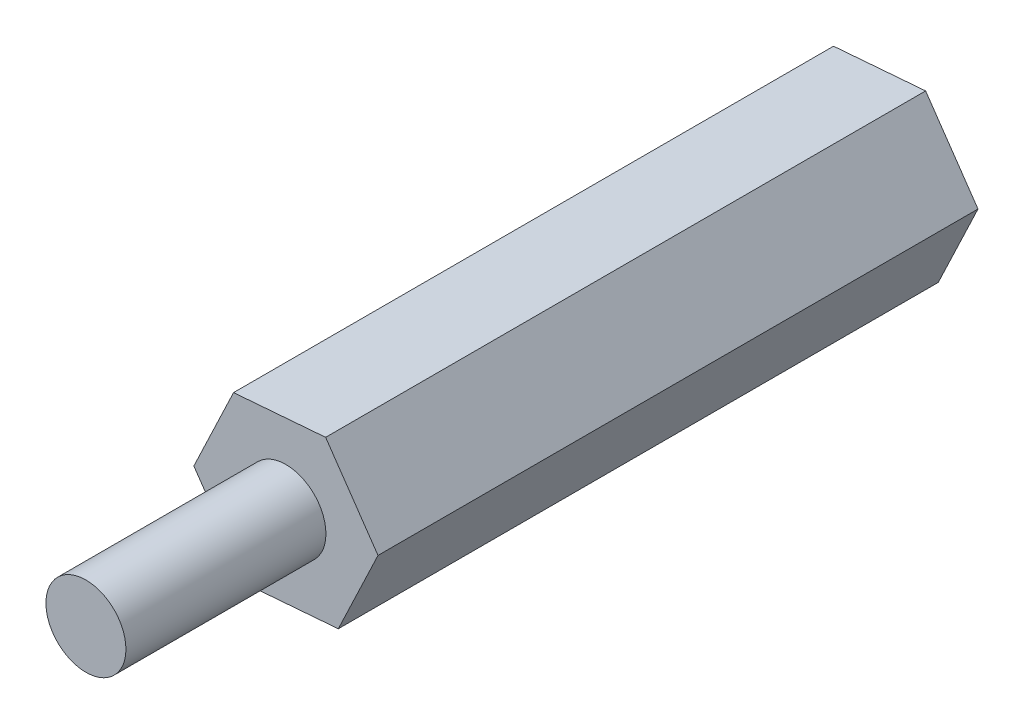
ISO-10303-21;
HEADER;
FILE_DESCRIPTION(('STEP AP214'),'2;1');
FILE_NAME('part.step','',(''),(''),'','','');
FILE_SCHEMA(('AUTOMOTIVE_DESIGN { 1 0 10303 214 1 1 1 1 }'));
ENDSEC;
DATA;
#1=APPLICATION_CONTEXT('core data for automotive mechanical design processes');
#2=APPLICATION_PROTOCOL_DEFINITION('international standard','automotive_design',2000,#1);
#3=PRODUCT_CONTEXT('',#1,'mechanical');
#4=PRODUCT('Part','Part','',(#3));
#5=PRODUCT_RELATED_PRODUCT_CATEGORY('part','',(#4));
#6=PRODUCT_DEFINITION_FORMATION('','',#4);
#7=PRODUCT_DEFINITION_CONTEXT('part definition',#1,'design');
#8=PRODUCT_DEFINITION('design','',#6,#7);
#9=PRODUCT_DEFINITION_SHAPE('','',#8);
#10=(LENGTH_UNIT() NAMED_UNIT(*) SI_UNIT(.MILLI.,.METRE.));
#11=(NAMED_UNIT(*) PLANE_ANGLE_UNIT() SI_UNIT($,.RADIAN.));
#12=(NAMED_UNIT(*) SI_UNIT($,.STERADIAN.) SOLID_ANGLE_UNIT());
#13=UNCERTAINTY_MEASURE_WITH_UNIT(LENGTH_MEASURE(1.E-05),#10,'distance_accuracy_value','');
#14=(GEOMETRIC_REPRESENTATION_CONTEXT(3) GLOBAL_UNCERTAINTY_ASSIGNED_CONTEXT((#13)) GLOBAL_UNIT_ASSIGNED_CONTEXT((#10,
#11,#12)) REPRESENTATION_CONTEXT('',''));
#15=CARTESIAN_POINT('',(0.,0.,0.));
#16=DIRECTION('',(0.,0.,1.));
#17=DIRECTION('',(1.,0.,0.));
#18=AXIS2_PLACEMENT_3D('',#15,#16,#17);
#19=CARTESIAN_POINT('',(1.30949428071029,-1.90225078843994,15.));
#20=DIRECTION('',(-0.90290973205585,0.429830217363592,0.));
#21=DIRECTION('',(-0.429830217363592,-0.90290973205585,0.));
#22=AXIS2_PLACEMENT_3D('',#19,#20,#21);
#23=PLANE('',#22);
#24=DIRECTION('',(0.429830217363592,0.90290973205585,0.));
#25=VECTOR('',#24,1.);
#26=CARTESIAN_POINT('',(1.30949428071029,-1.90225078843994,0.));
#27=LINE('',#26,#25);
#28=CARTESIAN_POINT('',(1.30949428071029,-1.90225078843994,0.));
#29=VERTEX_POINT('',#28);
#30=CARTESIAN_POINT('',(2.30214464751311,0.182929918985571,0.));
#31=VERTEX_POINT('',#30);
#32=EDGE_CURVE('E125',#29,#31,#27,.T.);
#33=ORIENTED_EDGE('',*,*,#32,.T.);
#34=DIRECTION('',(0.,0.,-1.));
#35=VECTOR('',#34,1.);
#36=CARTESIAN_POINT('',(2.30214464751311,0.182929918985571,15.));
#37=LINE('',#36,#35);
#38=CARTESIAN_POINT('',(2.30214464751311,0.182929918985571,15.));
#39=VERTEX_POINT('',#38);
#40=EDGE_CURVE('E42',#39,#31,#37,.T.);
#41=ORIENTED_EDGE('',*,*,#40,.F.);
#42=DIRECTION('',(0.429830217363592,0.90290973205585,0.));
#43=VECTOR('',#42,1.);
#44=CARTESIAN_POINT('',(1.30949428071029,-1.90225078843994,15.));
#45=LINE('',#44,#43);
#46=CARTESIAN_POINT('',(1.30949428071029,-1.90225078843994,15.));
#47=VERTEX_POINT('',#46);
#48=EDGE_CURVE('E136',#47,#39,#45,.T.);
#49=ORIENTED_EDGE('',*,*,#48,.F.);
#50=DIRECTION('',(0.,0.,-1.));
#51=VECTOR('',#50,1.);
#52=CARTESIAN_POINT('',(1.30949428071029,-1.90225078843994,15.));
#53=LINE('',#52,#51);
#54=EDGE_CURVE('E121',#47,#29,#53,.T.);
#55=ORIENTED_EDGE('',*,*,#54,.T.);
#56=EDGE_LOOP('',(#33,#41,#49,#55));
#57=FACE_BOUND('',#56,.T.);
#58=ADVANCED_FACE('F39',(#57),#23,.F.);
#59=CARTESIAN_POINT('',(2.30214464751311,0.182929918985571,15.));
#60=DIRECTION('',(-0.823698753578983,-0.56702765660277,0.));
#61=DIRECTION('',(0.56702765660277,-0.823698753578983,0.));
#62=AXIS2_PLACEMENT_3D('',#59,#60,#61);
#63=PLANE('',#62);
#64=DIRECTION('',(-0.56702765660277,0.823698753578983,0.));
#65=VECTOR('',#64,1.);
#66=CARTESIAN_POINT('',(2.30214464751311,0.182929918985571,0.));
#67=LINE('',#66,#65);
#68=CARTESIAN_POINT('',(0.992650366802822,2.08518070742551,0.));
#69=VERTEX_POINT('',#68);
#70=EDGE_CURVE('E128',#31,#69,#67,.T.);
#71=ORIENTED_EDGE('',*,*,#70,.T.);
#72=DIRECTION('',(0.,0.,-1.));
#73=VECTOR('',#72,1.);
#74=CARTESIAN_POINT('',(0.992650366802822,2.08518070742551,15.));
#75=LINE('',#74,#73);
#76=CARTESIAN_POINT('',(0.992650366802822,2.08518070742551,15.));
#77=VERTEX_POINT('',#76);
#78=EDGE_CURVE('E139',#77,#69,#75,.T.);
#79=ORIENTED_EDGE('',*,*,#78,.F.);
#80=DIRECTION('',(-0.56702765660277,0.823698753578983,0.));
#81=VECTOR('',#80,1.);
#82=CARTESIAN_POINT('',(2.30214464751311,0.182929918985571,15.));
#83=LINE('',#82,#81);
#84=EDGE_CURVE('E94',#39,#77,#83,.T.);
#85=ORIENTED_EDGE('',*,*,#84,.F.);
#86=ORIENTED_EDGE('',*,*,#40,.T.);
#87=EDGE_LOOP('',(#71,#79,#85,#86));
#88=FACE_BOUND('',#87,.T.);
#89=ADVANCED_FACE('F144',(#88),#63,.F.);
#90=CARTESIAN_POINT('',(0.992650366802822,2.08518070742551,15.));
#91=DIRECTION('',(0.0792109784768665,-0.996857873966363,0.));
#92=DIRECTION('',(0.996857873966363,0.0792109784768665,0.));
#93=AXIS2_PLACEMENT_3D('',#90,#91,#92);
#94=PLANE('',#93);
#95=DIRECTION('',(-0.996857873966363,-0.0792109784768665,0.));
#96=VECTOR('',#95,1.);
#97=CARTESIAN_POINT('',(0.992650366802822,2.08518070742551,0.));
#98=LINE('',#97,#96);
#99=CARTESIAN_POINT('',(-1.30949428071029,1.90225078843994,0.));
#100=VERTEX_POINT('',#99);
#101=EDGE_CURVE('E131',#69,#100,#98,.T.);
#102=ORIENTED_EDGE('',*,*,#101,.T.);
#103=DIRECTION('',(0.,0.,-1.));
#104=VECTOR('',#103,1.);
#105=CARTESIAN_POINT('',(-1.30949428071029,1.90225078843994,15.));
#106=LINE('',#105,#104);
#107=CARTESIAN_POINT('',(-1.30949428071029,1.90225078843994,15.));
#108=VERTEX_POINT('',#107);
#109=EDGE_CURVE('E116',#108,#100,#106,.T.);
#110=ORIENTED_EDGE('',*,*,#109,.F.);
#111=DIRECTION('',(-0.996857873966363,-0.0792109784768665,0.));
#112=VECTOR('',#111,1.);
#113=CARTESIAN_POINT('',(0.992650366802822,2.08518070742551,15.));
#114=LINE('',#113,#112);
#115=EDGE_CURVE('E107',#77,#108,#114,.T.);
#116=ORIENTED_EDGE('',*,*,#115,.F.);
#117=ORIENTED_EDGE('',*,*,#78,.T.);
#118=EDGE_LOOP('',(#102,#110,#116,#117));
#119=FACE_BOUND('',#118,.T.);
#120=ADVANCED_FACE('F150',(#119),#94,.F.);
#121=CARTESIAN_POINT('',(-1.30949428071029,1.90225078843994,15.));
#122=DIRECTION('',(0.90290973205585,-0.429830217363592,0.));
#123=DIRECTION('',(0.429830217363592,0.90290973205585,0.));
#124=AXIS2_PLACEMENT_3D('',#121,#122,#123);
#125=PLANE('',#124);
#126=DIRECTION('',(-0.429830217363592,-0.90290973205585,0.));
#127=VECTOR('',#126,1.);
#128=CARTESIAN_POINT('',(-1.30949428071029,1.90225078843994,0.));
#129=LINE('',#128,#127);
#130=CARTESIAN_POINT('',(-2.30214464751311,-0.182929918985571,0.));
#131=VERTEX_POINT('',#130);
#132=EDGE_CURVE('E115',#100,#131,#129,.T.);
#133=ORIENTED_EDGE('',*,*,#132,.T.);
#134=DIRECTION('',(0.,0.,-1.));
#135=VECTOR('',#134,1.);
#136=CARTESIAN_POINT('',(-2.30214464751311,-0.182929918985571,15.));
#137=LINE('',#136,#135);
#138=CARTESIAN_POINT('',(-2.30214464751311,-0.182929918985571,15.));
#139=VERTEX_POINT('',#138);
#140=EDGE_CURVE('E112',#139,#131,#137,.T.);
#141=ORIENTED_EDGE('',*,*,#140,.F.);
#142=DIRECTION('',(-0.429830217363592,-0.90290973205585,0.));
#143=VECTOR('',#142,1.);
#144=CARTESIAN_POINT('',(-1.30949428071029,1.90225078843994,15.));
#145=LINE('',#144,#143);
#146=EDGE_CURVE('E101',#108,#139,#145,.T.);
#147=ORIENTED_EDGE('',*,*,#146,.F.);
#148=ORIENTED_EDGE('',*,*,#109,.T.);
#149=EDGE_LOOP('',(#133,#141,#147,#148));
#150=FACE_BOUND('',#149,.T.);
#151=ADVANCED_FACE('F113',(#150),#125,.F.);
#152=CARTESIAN_POINT('',(-2.30214464751311,-0.182929918985571,15.));
#153=DIRECTION('',(0.823698753578983,0.56702765660277,0.));
#154=DIRECTION('',(-0.56702765660277,0.823698753578983,0.));
#155=AXIS2_PLACEMENT_3D('',#152,#153,#154);
#156=PLANE('',#155);
#157=DIRECTION('',(0.56702765660277,-0.823698753578983,0.));
#158=VECTOR('',#157,1.);
#159=CARTESIAN_POINT('',(-2.30214464751311,-0.182929918985571,0.));
#160=LINE('',#159,#158);
#161=CARTESIAN_POINT('',(-0.992650366802821,-2.08518070742551,0.));
#162=VERTEX_POINT('',#161);
#163=EDGE_CURVE('E79',#131,#162,#160,.T.);
#164=ORIENTED_EDGE('',*,*,#163,.T.);
#165=DIRECTION('',(0.,0.,-1.));
#166=VECTOR('',#165,1.);
#167=CARTESIAN_POINT('',(-0.992650366802821,-2.08518070742551,15.));
#168=LINE('',#167,#166);
#169=CARTESIAN_POINT('',(-0.992650366802821,-2.08518070742551,15.));
#170=VERTEX_POINT('',#169);
#171=EDGE_CURVE('E117',#170,#162,#168,.T.);
#172=ORIENTED_EDGE('',*,*,#171,.F.);
#173=DIRECTION('',(0.56702765660277,-0.823698753578983,0.));
#174=VECTOR('',#173,1.);
#175=CARTESIAN_POINT('',(-2.30214464751311,-0.182929918985571,15.));
#176=LINE('',#175,#174);
#177=EDGE_CURVE('E105',#139,#170,#176,.T.);
#178=ORIENTED_EDGE('',*,*,#177,.F.);
#179=ORIENTED_EDGE('',*,*,#140,.T.);
#180=EDGE_LOOP('',(#164,#172,#178,#179));
#181=FACE_BOUND('',#180,.T.);
#182=ADVANCED_FACE('F119',(#181),#156,.F.);
#183=CARTESIAN_POINT('',(-0.992650366802821,-2.08518070742551,15.));
#184=DIRECTION('',(-0.0792109784768666,0.996857873966363,0.));
#185=DIRECTION('',(-0.996857873966363,-0.0792109784768666,0.));
#186=AXIS2_PLACEMENT_3D('',#183,#184,#185);
#187=PLANE('',#186);
#188=DIRECTION('',(0.996857873966363,0.0792109784768666,0.));
#189=VECTOR('',#188,1.);
#190=CARTESIAN_POINT('',(-0.992650366802821,-2.08518070742551,0.));
#191=LINE('',#190,#189);
#192=EDGE_CURVE('E85',#162,#29,#191,.T.);
#193=ORIENTED_EDGE('',*,*,#192,.T.);
#194=ORIENTED_EDGE('',*,*,#54,.F.);
#195=DIRECTION('',(0.996857873966363,0.0792109784768666,0.));
#196=VECTOR('',#195,1.);
#197=CARTESIAN_POINT('',(-0.992650366802821,-2.08518070742551,15.));
#198=LINE('',#197,#196);
#199=EDGE_CURVE('E56',#170,#47,#198,.T.);
#200=ORIENTED_EDGE('',*,*,#199,.F.);
#201=ORIENTED_EDGE('',*,*,#171,.T.);
#202=EDGE_LOOP('',(#193,#194,#200,#201));
#203=FACE_BOUND('',#202,.T.);
#204=ADVANCED_FACE('F181',(#203),#187,.F.);
#205=CARTESIAN_POINT('',(0.,0.,15.));
#206=DIRECTION('',(0.,0.,1.));
#207=DIRECTION('',(1.,0.,0.));
#208=AXIS2_PLACEMENT_3D('',#205,#206,#207);
#209=PLANE('',#208);
#210=CARTESIAN_POINT('',(0.,0.,15.));
#211=DIRECTION('',(0.,0.,1.));
#212=DIRECTION('',(1.,0.,0.));
#213=AXIS2_PLACEMENT_3D('',#210,#211,#212);
#214=CIRCLE('',#213,1.);
#215=CARTESIAN_POINT('',(1.,0.,15.));
#216=VERTEX_POINT('',#215);
#217=EDGE_CURVE('E11',#216,#216,#214,.T.);
#218=ORIENTED_EDGE('',*,*,#217,.F.);
#219=EDGE_LOOP('',(#218));
#220=FACE_BOUND('',#219,.T.);
#221=ORIENTED_EDGE('',*,*,#48,.T.);
#222=ORIENTED_EDGE('',*,*,#84,.T.);
#223=ORIENTED_EDGE('',*,*,#115,.T.);
#224=ORIENTED_EDGE('',*,*,#146,.T.);
#225=ORIENTED_EDGE('',*,*,#177,.T.);
#226=ORIENTED_EDGE('',*,*,#199,.T.);
#227=EDGE_LOOP('',(#221,#222,#223,#224,#225,#226));
#228=FACE_BOUND('',#227,.T.);
#229=ADVANCED_FACE('F103',(#220,#228),#209,.T.);
#230=CARTESIAN_POINT('',(0.,0.,0.));
#231=DIRECTION('',(0.,0.,1.));
#232=DIRECTION('',(1.,0.,0.));
#233=AXIS2_PLACEMENT_3D('',#230,#231,#232);
#234=PLANE('',#233);
#235=CARTESIAN_POINT('',(0.,0.,0.));
#236=DIRECTION('',(0.,0.,-1.));
#237=DIRECTION('',(-1.,0.,0.));
#238=AXIS2_PLACEMENT_3D('',#235,#236,#237);
#239=CIRCLE('',#238,1.);
#240=CARTESIAN_POINT('',(-1.,0.,0.));
#241=VERTEX_POINT('',#240);
#242=EDGE_CURVE('E157',#241,#241,#239,.T.);
#243=ORIENTED_EDGE('',*,*,#242,.F.);
#244=EDGE_LOOP('',(#243));
#245=FACE_BOUND('',#244,.T.);
#246=ORIENTED_EDGE('',*,*,#32,.F.);
#247=ORIENTED_EDGE('',*,*,#192,.F.);
#248=ORIENTED_EDGE('',*,*,#163,.F.);
#249=ORIENTED_EDGE('',*,*,#132,.F.);
#250=ORIENTED_EDGE('',*,*,#101,.F.);
#251=ORIENTED_EDGE('',*,*,#70,.F.);
#252=EDGE_LOOP('',(#246,#247,#248,#249,#250,#251));
#253=FACE_BOUND('',#252,.T.);
#254=ADVANCED_FACE('F149',(#245,#253),#234,.F.);
#255=CARTESIAN_POINT('',(0.,0.,20.));
#256=DIRECTION('',(0.,0.,-1.));
#257=DIRECTION('',(-1.,0.,0.));
#258=AXIS2_PLACEMENT_3D('',#255,#256,#257);
#259=CYLINDRICAL_SURFACE('',#258,1.);
#260=CARTESIAN_POINT('',(0.,0.,20.));
#261=DIRECTION('',(0.,0.,1.));
#262=DIRECTION('',(1.,0.,0.));
#263=AXIS2_PLACEMENT_3D('',#260,#261,#262);
#264=CIRCLE('',#263,1.);
#265=CARTESIAN_POINT('',(1.,0.,20.));
#266=VERTEX_POINT('',#265);
#267=EDGE_CURVE('E129',#266,#266,#264,.T.);
#268=ORIENTED_EDGE('',*,*,#267,.F.);
#269=EDGE_LOOP('',(#268));
#270=FACE_BOUND('',#269,.T.);
#271=ORIENTED_EDGE('',*,*,#217,.T.);
#272=EDGE_LOOP('',(#271));
#273=FACE_BOUND('',#272,.T.);
#274=ADVANCED_FACE('F173',(#270,#273),#259,.T.);
#275=CARTESIAN_POINT('',(0.,0.,20.));
#276=DIRECTION('',(0.,0.,1.));
#277=DIRECTION('',(1.,0.,0.));
#278=AXIS2_PLACEMENT_3D('',#275,#276,#277);
#279=PLANE('',#278);
#280=ORIENTED_EDGE('',*,*,#267,.T.);
#281=EDGE_LOOP('',(#280));
#282=FACE_BOUND('',#281,.T.);
#283=ADVANCED_FACE('F168',(#282),#279,.T.);
#284=CARTESIAN_POINT('',(0.,0.,5.));
#285=DIRECTION('',(0.,0.,-1.));
#286=DIRECTION('',(-1.,0.,0.));
#287=AXIS2_PLACEMENT_3D('',#284,#285,#286);
#288=CYLINDRICAL_SURFACE('',#287,1.);
#289=CARTESIAN_POINT('',(0.,0.,5.));
#290=DIRECTION('',(0.,0.,-1.));
#291=DIRECTION('',(-1.,0.,0.));
#292=AXIS2_PLACEMENT_3D('',#289,#290,#291);
#293=CIRCLE('',#292,1.);
#294=CARTESIAN_POINT('',(-1.,0.,5.));
#295=VERTEX_POINT('',#294);
#296=EDGE_CURVE('E156',#295,#295,#293,.T.);
#297=ORIENTED_EDGE('',*,*,#296,.F.);
#298=EDGE_LOOP('',(#297));
#299=FACE_BOUND('',#298,.T.);
#300=ORIENTED_EDGE('',*,*,#242,.T.);
#301=EDGE_LOOP('',(#300));
#302=FACE_BOUND('',#301,.T.);
#303=ADVANCED_FACE('F165',(#299,#302),#288,.F.);
#304=CARTESIAN_POINT('',(0.,0.,5.));
#305=DIRECTION('',(0.,0.,-1.));
#306=DIRECTION('',(-1.,0.,0.));
#307=AXIS2_PLACEMENT_3D('',#304,#305,#306);
#308=PLANE('',#307);
#309=ORIENTED_EDGE('',*,*,#296,.T.);
#310=EDGE_LOOP('',(#309));
#311=FACE_BOUND('',#310,.T.);
#312=ADVANCED_FACE('F163',(#311),#308,.T.);
#313=CLOSED_SHELL('',(#58,#89,#120,#151,#182,#204,#229,#254,#274,#283,#303,#312));
#314=MANIFOLD_SOLID_BREP('B2',#313);
#315=ADVANCED_BREP_SHAPE_REPRESENTATION('',(#18,#314),#14);
#316=SHAPE_DEFINITION_REPRESENTATION(#9,#315);
ENDSEC;
END-ISO-10303-21;
